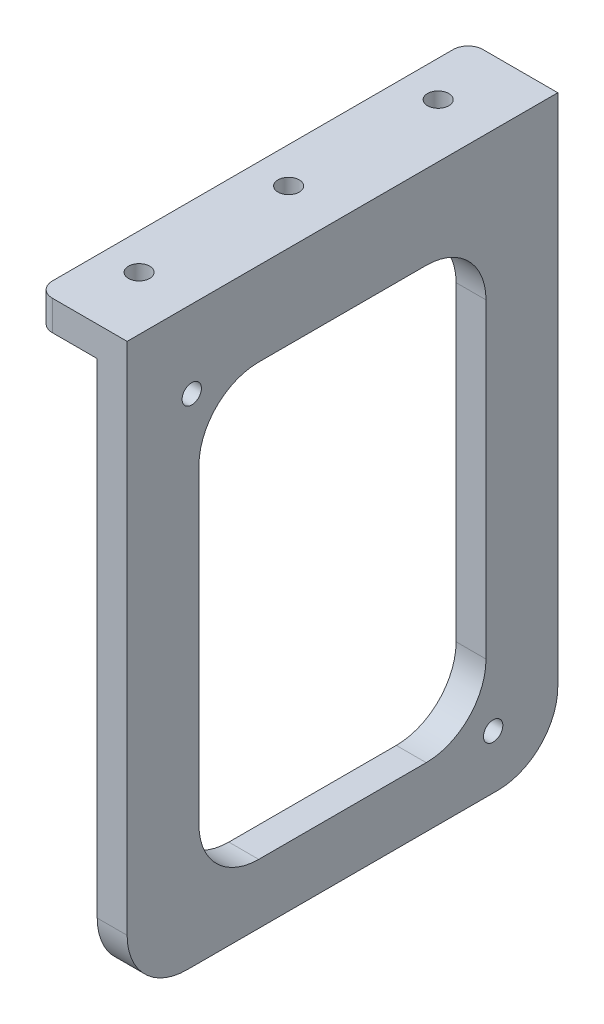
ISO-10303-21;
HEADER;
FILE_DESCRIPTION(('STEP AP214'),'2;1');
FILE_NAME('part.step','',(''),(''),'','','');
FILE_SCHEMA(('AUTOMOTIVE_DESIGN { 1 0 10303 214 1 1 1 1 }'));
ENDSEC;
DATA;
#1=APPLICATION_CONTEXT('core data for automotive mechanical design processes');
#2=APPLICATION_PROTOCOL_DEFINITION('international standard','automotive_design',2000,#1);
#3=PRODUCT_CONTEXT('',#1,'mechanical');
#4=PRODUCT('Part','Part','',(#3));
#5=PRODUCT_RELATED_PRODUCT_CATEGORY('part','',(#4));
#6=PRODUCT_DEFINITION_FORMATION('','',#4);
#7=PRODUCT_DEFINITION_CONTEXT('part definition',#1,'design');
#8=PRODUCT_DEFINITION('design','',#6,#7);
#9=PRODUCT_DEFINITION_SHAPE('','',#8);
#10=(LENGTH_UNIT() NAMED_UNIT(*) SI_UNIT(.MILLI.,.METRE.));
#11=(NAMED_UNIT(*) PLANE_ANGLE_UNIT() SI_UNIT($,.RADIAN.));
#12=(NAMED_UNIT(*) SI_UNIT($,.STERADIAN.) SOLID_ANGLE_UNIT());
#13=UNCERTAINTY_MEASURE_WITH_UNIT(LENGTH_MEASURE(1.E-05),#10,'distance_accuracy_value','');
#14=(GEOMETRIC_REPRESENTATION_CONTEXT(3) GLOBAL_UNCERTAINTY_ASSIGNED_CONTEXT((#13)) GLOBAL_UNIT_ASSIGNED_CONTEXT((#10,
#11,#12)) REPRESENTATION_CONTEXT('',''));
#15=CARTESIAN_POINT('',(0.,0.,0.));
#16=DIRECTION('',(0.,0.,1.));
#17=DIRECTION('',(1.,0.,0.));
#18=AXIS2_PLACEMENT_3D('',#15,#16,#17);
#19=CARTESIAN_POINT('',(6.35,27.305,-22.86));
#20=DIRECTION('',(1.,0.,0.));
#21=DIRECTION('',(0.,0.,-1.));
#22=AXIS2_PLACEMENT_3D('',#19,#20,#21);
#23=PLANE('',#22);
#24=CARTESIAN_POINT('',(6.35,22.23,16.));
#25=DIRECTION('',(-1.,0.,0.));
#26=DIRECTION('',(0.,0.,1.));
#27=AXIS2_PLACEMENT_3D('',#24,#25,#26);
#28=CIRCLE('',#27,1.025);
#29=CARTESIAN_POINT('',(6.35,22.23,17.025));
#30=VERTEX_POINT('',#29);
#31=EDGE_CURVE('E278',#30,#30,#28,.T.);
#32=ORIENTED_EDGE('',*,*,#31,.F.);
#33=EDGE_LOOP('',(#32));
#34=FACE_BOUND('',#33,.T.);
#35=DIRECTION('',(0.,-1.,0.));
#36=VECTOR('',#35,1.);
#37=CARTESIAN_POINT('',(6.35,-30.48,-22.86));
#38=LINE('',#37,#36);
#39=CARTESIAN_POINT('',(6.35,27.305,-22.86));
#40=VERTEX_POINT('',#39);
#41=CARTESIAN_POINT('',(6.35,-24.13,-22.86));
#42=VERTEX_POINT('',#41);
#43=EDGE_CURVE('E299',#40,#42,#38,.T.);
#44=ORIENTED_EDGE('',*,*,#43,.T.);
#45=CARTESIAN_POINT('',(6.35,-24.13,-16.51));
#46=DIRECTION('',(1.,0.,0.));
#47=DIRECTION('',(0.,0.,-1.));
#48=AXIS2_PLACEMENT_3D('',#45,#46,#47);
#49=CIRCLE('',#48,6.35);
#50=CARTESIAN_POINT('',(6.35,-30.48,-16.51));
#51=VERTEX_POINT('',#50);
#52=EDGE_CURVE('E225',#42,#51,#49,.F.);
#53=ORIENTED_EDGE('',*,*,#52,.T.);
#54=DIRECTION('',(0.,0.,1.));
#55=VECTOR('',#54,1.);
#56=CARTESIAN_POINT('',(6.35,-30.48,-22.86));
#57=LINE('',#56,#55);
#58=CARTESIAN_POINT('',(6.35,-30.48,16.51));
#59=VERTEX_POINT('',#58);
#60=EDGE_CURVE('E174',#51,#59,#57,.T.);
#61=ORIENTED_EDGE('',*,*,#60,.T.);
#62=CARTESIAN_POINT('',(6.35,-24.13,16.51));
#63=DIRECTION('',(1.,0.,0.));
#64=DIRECTION('',(0.,0.,-1.));
#65=AXIS2_PLACEMENT_3D('',#62,#63,#64);
#66=CIRCLE('',#65,6.35);
#67=CARTESIAN_POINT('',(6.35,-24.13,22.86));
#68=VERTEX_POINT('',#67);
#69=EDGE_CURVE('E170',#59,#68,#66,.F.);
#70=ORIENTED_EDGE('',*,*,#69,.T.);
#71=DIRECTION('',(0.,1.,0.));
#72=VECTOR('',#71,1.);
#73=CARTESIAN_POINT('',(6.35,-30.48,22.86));
#74=LINE('',#73,#72);
#75=CARTESIAN_POINT('',(6.35,27.305,22.86));
#76=VERTEX_POINT('',#75);
#77=EDGE_CURVE('E163',#68,#76,#74,.T.);
#78=ORIENTED_EDGE('',*,*,#77,.T.);
#79=DIRECTION('',(0.,0.,-1.));
#80=VECTOR('',#79,1.);
#81=CARTESIAN_POINT('',(6.35,27.305,-22.86));
#82=LINE('',#81,#80);
#83=EDGE_CURVE('E167',#76,#40,#82,.T.);
#84=ORIENTED_EDGE('',*,*,#83,.T.);
#85=EDGE_LOOP('',(#44,#53,#61,#70,#78,#84));
#86=FACE_BOUND('',#85,.T.);
#87=DIRECTION('',(0.,-1.,0.));
#88=VECTOR('',#87,1.);
#89=CARTESIAN_POINT('',(6.35,27.305,15.24));
#90=LINE('',#89,#88);
#91=CARTESIAN_POINT('',(6.35,15.24,15.24));
#92=VERTEX_POINT('',#91);
#93=CARTESIAN_POINT('',(6.35,-17.78,15.24));
#94=VERTEX_POINT('',#93);
#95=EDGE_CURVE('E212',#92,#94,#90,.T.);
#96=ORIENTED_EDGE('',*,*,#95,.T.);
#97=CARTESIAN_POINT('',(6.35,-17.78,8.89));
#98=DIRECTION('',(1.,0.,0.));
#99=DIRECTION('',(0.,0.,-1.));
#100=AXIS2_PLACEMENT_3D('',#97,#98,#99);
#101=CIRCLE('',#100,6.35);
#102=CARTESIAN_POINT('',(6.35,-24.13,8.89));
#103=VERTEX_POINT('',#102);
#104=EDGE_CURVE('E264',#94,#103,#101,.T.);
#105=ORIENTED_EDGE('',*,*,#104,.T.);
#106=DIRECTION('',(0.,0.,-1.));
#107=VECTOR('',#106,1.);
#108=CARTESIAN_POINT('',(6.35,-24.13,-22.86));
#109=LINE('',#108,#107);
#110=CARTESIAN_POINT('',(6.35,-24.13,-8.89));
#111=VERTEX_POINT('',#110);
#112=EDGE_CURVE('E215',#103,#111,#109,.T.);
#113=ORIENTED_EDGE('',*,*,#112,.T.);
#114=CARTESIAN_POINT('',(6.35,-17.78,-8.89));
#115=DIRECTION('',(1.,0.,0.));
#116=DIRECTION('',(0.,0.,-1.));
#117=AXIS2_PLACEMENT_3D('',#114,#115,#116);
#118=CIRCLE('',#117,6.35);
#119=CARTESIAN_POINT('',(6.35,-17.78,-15.24));
#120=VERTEX_POINT('',#119);
#121=EDGE_CURVE('E260',#111,#120,#118,.T.);
#122=ORIENTED_EDGE('',*,*,#121,.T.);
#123=DIRECTION('',(0.,1.,0.));
#124=VECTOR('',#123,1.);
#125=CARTESIAN_POINT('',(6.35,27.305,-15.24));
#126=LINE('',#125,#124);
#127=CARTESIAN_POINT('',(6.35,15.24,-15.24));
#128=VERTEX_POINT('',#127);
#129=EDGE_CURVE('E218',#120,#128,#126,.T.);
#130=ORIENTED_EDGE('',*,*,#129,.T.);
#131=CARTESIAN_POINT('',(6.35,15.24,-8.89));
#132=DIRECTION('',(1.,0.,0.));
#133=DIRECTION('',(0.,0.,-1.));
#134=AXIS2_PLACEMENT_3D('',#131,#132,#133);
#135=CIRCLE('',#134,6.35);
#136=CARTESIAN_POINT('',(6.35,21.59,-8.89));
#137=VERTEX_POINT('',#136);
#138=EDGE_CURVE('E268',#128,#137,#135,.T.);
#139=ORIENTED_EDGE('',*,*,#138,.T.);
#140=DIRECTION('',(0.,0.,1.));
#141=VECTOR('',#140,1.);
#142=CARTESIAN_POINT('',(6.35,21.59,-22.86));
#143=LINE('',#142,#141);
#144=CARTESIAN_POINT('',(6.35,21.59,8.89));
#145=VERTEX_POINT('',#144);
#146=EDGE_CURVE('E209',#137,#145,#143,.T.);
#147=ORIENTED_EDGE('',*,*,#146,.T.);
#148=CARTESIAN_POINT('',(6.35,15.24,8.89));
#149=DIRECTION('',(1.,0.,0.));
#150=DIRECTION('',(0.,0.,-1.));
#151=AXIS2_PLACEMENT_3D('',#148,#149,#150);
#152=CIRCLE('',#151,6.35);
#153=EDGE_CURVE('E272',#145,#92,#152,.T.);
#154=ORIENTED_EDGE('',*,*,#153,.T.);
#155=EDGE_LOOP('',(#96,#105,#113,#122,#130,#139,#147,#154));
#156=FACE_BOUND('',#155,.T.);
#157=CARTESIAN_POINT('',(6.35,-24.77,-16.));
#158=DIRECTION('',(-1.,0.,0.));
#159=DIRECTION('',(0.,0.,1.));
#160=AXIS2_PLACEMENT_3D('',#157,#158,#159);
#161=CIRCLE('',#160,1.025);
#162=CARTESIAN_POINT('',(6.35,-24.77,-14.975));
#163=VERTEX_POINT('',#162);
#164=EDGE_CURVE('E277',#163,#163,#161,.T.);
#165=ORIENTED_EDGE('',*,*,#164,.F.);
#166=EDGE_LOOP('',(#165));
#167=FACE_BOUND('',#166,.T.);
#168=ADVANCED_FACE('F36',(#34,#86,#156,#167),#23,.F.);
#169=CARTESIAN_POINT('',(9.525,-30.48,-22.86));
#170=DIRECTION('',(0.,0.,1.));
#171=DIRECTION('',(1.,0.,0.));
#172=AXIS2_PLACEMENT_3D('',#169,#170,#171);
#173=PLANE('',#172);
#174=DIRECTION('',(-1.,0.,0.));
#175=VECTOR('',#174,1.);
#176=CARTESIAN_POINT('',(6.35,27.305,-22.86));
#177=LINE('',#176,#175);
#178=CARTESIAN_POINT('',(1.5875,27.305,-22.86));
#179=VERTEX_POINT('',#178);
#180=EDGE_CURVE('E181',#40,#179,#177,.T.);
#181=ORIENTED_EDGE('',*,*,#180,.T.);
#182=DIRECTION('',(0.,1.,0.));
#183=VECTOR('',#182,1.);
#184=CARTESIAN_POINT('',(1.5875,30.48,-22.86));
#185=LINE('',#184,#183);
#186=CARTESIAN_POINT('',(1.5875,30.48,-22.86));
#187=VERTEX_POINT('',#186);
#188=EDGE_CURVE('E11',#179,#187,#185,.T.);
#189=ORIENTED_EDGE('',*,*,#188,.T.);
#190=DIRECTION('',(-1.,0.,0.));
#191=VECTOR('',#190,1.);
#192=CARTESIAN_POINT('',(9.525,30.48,-22.86));
#193=LINE('',#192,#191);
#194=CARTESIAN_POINT('',(9.525,30.48,-22.86));
#195=VERTEX_POINT('',#194);
#196=EDGE_CURVE('E206',#195,#187,#193,.T.);
#197=ORIENTED_EDGE('',*,*,#196,.F.);
#198=DIRECTION('',(0.,1.,0.));
#199=VECTOR('',#198,1.);
#200=CARTESIAN_POINT('',(9.525,-30.48,-22.86));
#201=LINE('',#200,#199);
#202=CARTESIAN_POINT('',(9.525,-24.13,-22.86));
#203=VERTEX_POINT('',#202);
#204=EDGE_CURVE('E193',#203,#195,#201,.T.);
#205=ORIENTED_EDGE('',*,*,#204,.F.);
#206=DIRECTION('',(-1.,0.,0.));
#207=VECTOR('',#206,1.);
#208=CARTESIAN_POINT('',(9.525,-24.13,-22.86));
#209=LINE('',#208,#207);
#210=EDGE_CURVE('E221',#203,#42,#209,.T.);
#211=ORIENTED_EDGE('',*,*,#210,.T.);
#212=ORIENTED_EDGE('',*,*,#43,.F.);
#213=EDGE_LOOP('',(#181,#189,#197,#205,#211,#212));
#214=FACE_BOUND('',#213,.T.);
#215=ADVANCED_FACE('F345',(#214),#173,.F.);
#216=CARTESIAN_POINT('',(9.525,30.48,22.86));
#217=DIRECTION('',(0.,-1.,0.));
#218=DIRECTION('',(0.,0.,-1.));
#219=AXIS2_PLACEMENT_3D('',#216,#217,#218);
#220=PLANE('',#219);
#221=CARTESIAN_POINT('',(3.81,30.48,-15.875));
#222=DIRECTION('',(0.,1.,0.));
#223=DIRECTION('',(0.,0.,1.));
#224=AXIS2_PLACEMENT_3D('',#221,#222,#223);
#225=CIRCLE('',#224,1.13029999999999);
#226=CARTESIAN_POINT('',(3.81,30.48,-14.7447));
#227=VERTEX_POINT('',#226);
#228=EDGE_CURVE('E337',#227,#227,#225,.T.);
#229=ORIENTED_EDGE('',*,*,#228,.F.);
#230=EDGE_LOOP('',(#229));
#231=FACE_BOUND('',#230,.T.);
#232=CARTESIAN_POINT('',(3.81,30.48,15.875));
#233=DIRECTION('',(0.,1.,0.));
#234=DIRECTION('',(0.,0.,1.));
#235=AXIS2_PLACEMENT_3D('',#232,#233,#234);
#236=CIRCLE('',#235,1.13029999999999);
#237=CARTESIAN_POINT('',(3.81,30.48,17.0053));
#238=VERTEX_POINT('',#237);
#239=EDGE_CURVE('E331',#238,#238,#236,.T.);
#240=ORIENTED_EDGE('',*,*,#239,.F.);
#241=EDGE_LOOP('',(#240));
#242=FACE_BOUND('',#241,.T.);
#243=CARTESIAN_POINT('',(3.81,30.48,0.));
#244=DIRECTION('',(0.,1.,0.));
#245=DIRECTION('',(0.,0.,1.));
#246=AXIS2_PLACEMENT_3D('',#243,#244,#245);
#247=CIRCLE('',#246,1.13029999999999);
#248=CARTESIAN_POINT('',(3.81,30.48,1.13029999999999));
#249=VERTEX_POINT('',#248);
#250=EDGE_CURVE('E325',#249,#249,#247,.T.);
#251=ORIENTED_EDGE('',*,*,#250,.F.);
#252=EDGE_LOOP('',(#251));
#253=FACE_BOUND('',#252,.T.);
#254=DIRECTION('',(0.,0.,1.));
#255=VECTOR('',#254,1.);
#256=CARTESIAN_POINT('',(0.,30.48,22.86));
#257=LINE('',#256,#255);
#258=CARTESIAN_POINT('',(0.,30.48,-21.2725));
#259=VERTEX_POINT('',#258);
#260=CARTESIAN_POINT('',(0.,30.48,21.2725));
#261=VERTEX_POINT('',#260);
#262=EDGE_CURVE('E189',#259,#261,#257,.T.);
#263=ORIENTED_EDGE('',*,*,#262,.T.);
#264=CARTESIAN_POINT('',(1.5875,30.48,21.2725));
#265=DIRECTION('',(0.,-1.,0.));
#266=DIRECTION('',(0.,0.,-1.));
#267=AXIS2_PLACEMENT_3D('',#264,#265,#266);
#268=CIRCLE('',#267,1.5875);
#269=CARTESIAN_POINT('',(1.5875,30.48,22.86));
#270=VERTEX_POINT('',#269);
#271=EDGE_CURVE('E44',#261,#270,#268,.F.);
#272=ORIENTED_EDGE('',*,*,#271,.T.);
#273=DIRECTION('',(-1.,0.,0.));
#274=VECTOR('',#273,1.);
#275=CARTESIAN_POINT('',(9.525,30.48,22.86));
#276=LINE('',#275,#274);
#277=CARTESIAN_POINT('',(9.525,30.48,22.86));
#278=VERTEX_POINT('',#277);
#279=EDGE_CURVE('E203',#278,#270,#276,.T.);
#280=ORIENTED_EDGE('',*,*,#279,.F.);
#281=DIRECTION('',(0.,0.,1.));
#282=VECTOR('',#281,1.);
#283=CARTESIAN_POINT('',(9.525,30.48,22.86));
#284=LINE('',#283,#282);
#285=EDGE_CURVE('E195',#195,#278,#284,.T.);
#286=ORIENTED_EDGE('',*,*,#285,.F.);
#287=ORIENTED_EDGE('',*,*,#196,.T.);
#288=CARTESIAN_POINT('',(1.5875,30.48,-21.2725));
#289=DIRECTION('',(0.,-1.,0.));
#290=DIRECTION('',(0.,0.,-1.));
#291=AXIS2_PLACEMENT_3D('',#288,#289,#290);
#292=CIRCLE('',#291,1.5875);
#293=EDGE_CURVE('E51',#187,#259,#292,.F.);
#294=ORIENTED_EDGE('',*,*,#293,.T.);
#295=EDGE_LOOP('',(#263,#272,#280,#286,#287,#294));
#296=FACE_BOUND('',#295,.T.);
#297=ADVANCED_FACE('F290',(#231,#242,#253,#296),#220,.F.);
#298=CARTESIAN_POINT('',(9.525,-30.48,22.86));
#299=DIRECTION('',(0.,0.,-1.));
#300=DIRECTION('',(-1.,0.,0.));
#301=AXIS2_PLACEMENT_3D('',#298,#299,#300);
#302=PLANE('',#301);
#303=ORIENTED_EDGE('',*,*,#279,.T.);
#304=DIRECTION('',(0.,-1.,0.));
#305=VECTOR('',#304,1.);
#306=CARTESIAN_POINT('',(1.5875,27.305,22.86));
#307=LINE('',#306,#305);
#308=CARTESIAN_POINT('',(1.5875,27.305,22.86));
#309=VERTEX_POINT('',#308);
#310=EDGE_CURVE('E187',#270,#309,#307,.T.);
#311=ORIENTED_EDGE('',*,*,#310,.T.);
#312=DIRECTION('',(-1.,0.,0.));
#313=VECTOR('',#312,1.);
#314=CARTESIAN_POINT('',(6.35,27.305,22.86));
#315=LINE('',#314,#313);
#316=EDGE_CURVE('E179',#76,#309,#315,.T.);
#317=ORIENTED_EDGE('',*,*,#316,.F.);
#318=ORIENTED_EDGE('',*,*,#77,.F.);
#319=DIRECTION('',(-1.,0.,0.));
#320=VECTOR('',#319,1.);
#321=CARTESIAN_POINT('',(9.525,-24.13,22.86));
#322=LINE('',#321,#320);
#323=CARTESIAN_POINT('',(9.525,-24.13,22.86));
#324=VERTEX_POINT('',#323);
#325=EDGE_CURVE('E236',#68,#324,#322,.F.);
#326=ORIENTED_EDGE('',*,*,#325,.T.);
#327=DIRECTION('',(0.,-1.,0.));
#328=VECTOR('',#327,1.);
#329=CARTESIAN_POINT('',(9.525,-30.48,22.86));
#330=LINE('',#329,#328);
#331=EDGE_CURVE('E197',#278,#324,#330,.T.);
#332=ORIENTED_EDGE('',*,*,#331,.F.);
#333=EDGE_LOOP('',(#303,#311,#317,#318,#326,#332));
#334=FACE_BOUND('',#333,.T.);
#335=ADVANCED_FACE('F185',(#334),#302,.F.);
#336=CARTESIAN_POINT('',(9.525,-30.48,22.86));
#337=DIRECTION('',(0.,1.,0.));
#338=DIRECTION('',(0.,0.,1.));
#339=AXIS2_PLACEMENT_3D('',#336,#337,#338);
#340=PLANE('',#339);
#341=ORIENTED_EDGE('',*,*,#60,.F.);
#342=DIRECTION('',(-1.,0.,0.));
#343=VECTOR('',#342,1.);
#344=CARTESIAN_POINT('',(9.525,-30.48,-16.51));
#345=LINE('',#344,#343);
#346=CARTESIAN_POINT('',(9.525,-30.48,-16.51));
#347=VERTEX_POINT('',#346);
#348=EDGE_CURVE('E230',#51,#347,#345,.F.);
#349=ORIENTED_EDGE('',*,*,#348,.T.);
#350=DIRECTION('',(0.,0.,-1.));
#351=VECTOR('',#350,1.);
#352=CARTESIAN_POINT('',(9.525,-30.48,22.86));
#353=LINE('',#352,#351);
#354=CARTESIAN_POINT('',(9.525,-30.48,16.51));
#355=VERTEX_POINT('',#354);
#356=EDGE_CURVE('E200',#355,#347,#353,.T.);
#357=ORIENTED_EDGE('',*,*,#356,.F.);
#358=DIRECTION('',(-1.,0.,0.));
#359=VECTOR('',#358,1.);
#360=CARTESIAN_POINT('',(9.525,-30.48,16.51));
#361=LINE('',#360,#359);
#362=EDGE_CURVE('E227',#355,#59,#361,.T.);
#363=ORIENTED_EDGE('',*,*,#362,.T.);
#364=EDGE_LOOP('',(#341,#349,#357,#363));
#365=FACE_BOUND('',#364,.T.);
#366=ADVANCED_FACE('F386',(#365),#340,.F.);
#367=CARTESIAN_POINT('',(9.525,30.48,-22.86));
#368=DIRECTION('',(-1.,0.,0.));
#369=DIRECTION('',(0.,0.,1.));
#370=AXIS2_PLACEMENT_3D('',#367,#368,#369);
#371=PLANE('',#370);
#372=CARTESIAN_POINT('',(9.525,22.23,16.));
#373=DIRECTION('',(-1.,0.,0.));
#374=DIRECTION('',(0.,0.,1.));
#375=AXIS2_PLACEMENT_3D('',#372,#373,#374);
#376=CIRCLE('',#375,1.025);
#377=CARTESIAN_POINT('',(9.525,22.23,17.025));
#378=VERTEX_POINT('',#377);
#379=EDGE_CURVE('E274',#378,#378,#376,.T.);
#380=ORIENTED_EDGE('',*,*,#379,.T.);
#381=EDGE_LOOP('',(#380));
#382=FACE_BOUND('',#381,.T.);
#383=CARTESIAN_POINT('',(9.525,-24.77,-16.));
#384=DIRECTION('',(-1.,0.,0.));
#385=DIRECTION('',(0.,0.,1.));
#386=AXIS2_PLACEMENT_3D('',#383,#384,#385);
#387=CIRCLE('',#386,1.025);
#388=CARTESIAN_POINT('',(9.525,-24.77,-14.975));
#389=VERTEX_POINT('',#388);
#390=EDGE_CURVE('E315',#389,#389,#387,.T.);
#391=ORIENTED_EDGE('',*,*,#390,.T.);
#392=EDGE_LOOP('',(#391));
#393=FACE_BOUND('',#392,.T.);
#394=DIRECTION('',(0.,0.,1.));
#395=VECTOR('',#394,1.);
#396=CARTESIAN_POINT('',(9.525,21.59,15.24));
#397=LINE('',#396,#395);
#398=CARTESIAN_POINT('',(9.525,21.59,-8.88999999999999));
#399=VERTEX_POINT('',#398);
#400=CARTESIAN_POINT('',(9.525,21.59,8.89));
#401=VERTEX_POINT('',#400);
#402=EDGE_CURVE('E309',#399,#401,#397,.T.);
#403=ORIENTED_EDGE('',*,*,#402,.F.);
#404=CARTESIAN_POINT('',(9.525,15.24,-8.89));
#405=DIRECTION('',(-1.,0.,0.));
#406=DIRECTION('',(0.,0.,1.));
#407=AXIS2_PLACEMENT_3D('',#404,#405,#406);
#408=CIRCLE('',#407,6.35);
#409=CARTESIAN_POINT('',(9.525,15.24,-15.24));
#410=VERTEX_POINT('',#409);
#411=EDGE_CURVE('E266',#399,#410,#408,.T.);
#412=ORIENTED_EDGE('',*,*,#411,.T.);
#413=DIRECTION('',(0.,1.,0.));
#414=VECTOR('',#413,1.);
#415=CARTESIAN_POINT('',(9.525,-24.13,-15.24));
#416=LINE('',#415,#414);
#417=CARTESIAN_POINT('',(9.525,-17.78,-15.24));
#418=VERTEX_POINT('',#417);
#419=EDGE_CURVE('E312',#418,#410,#416,.T.);
#420=ORIENTED_EDGE('',*,*,#419,.F.);
#421=CARTESIAN_POINT('',(9.525,-17.78,-8.89));
#422=DIRECTION('',(-1.,0.,0.));
#423=DIRECTION('',(0.,0.,1.));
#424=AXIS2_PLACEMENT_3D('',#421,#422,#423);
#425=CIRCLE('',#424,6.35);
#426=CARTESIAN_POINT('',(9.525,-24.13,-8.88999999999999));
#427=VERTEX_POINT('',#426);
#428=EDGE_CURVE('E258',#418,#427,#425,.T.);
#429=ORIENTED_EDGE('',*,*,#428,.T.);
#430=DIRECTION('',(0.,0.,-1.));
#431=VECTOR('',#430,1.);
#432=CARTESIAN_POINT('',(9.525,-24.13,15.24));
#433=LINE('',#432,#431);
#434=CARTESIAN_POINT('',(9.525,-24.13,8.89));
#435=VERTEX_POINT('',#434);
#436=EDGE_CURVE('E300',#435,#427,#433,.T.);
#437=ORIENTED_EDGE('',*,*,#436,.F.);
#438=CARTESIAN_POINT('',(9.525,-17.78,8.89));
#439=DIRECTION('',(-1.,0.,0.));
#440=DIRECTION('',(0.,0.,1.));
#441=AXIS2_PLACEMENT_3D('',#438,#439,#440);
#442=CIRCLE('',#441,6.35);
#443=CARTESIAN_POINT('',(9.525,-17.78,15.24));
#444=VERTEX_POINT('',#443);
#445=EDGE_CURVE('E262',#435,#444,#442,.T.);
#446=ORIENTED_EDGE('',*,*,#445,.T.);
#447=DIRECTION('',(0.,-1.,0.));
#448=VECTOR('',#447,1.);
#449=CARTESIAN_POINT('',(9.525,-24.13,15.24));
#450=LINE('',#449,#448);
#451=CARTESIAN_POINT('',(9.525,15.24,15.24));
#452=VERTEX_POINT('',#451);
#453=EDGE_CURVE('E303',#452,#444,#450,.T.);
#454=ORIENTED_EDGE('',*,*,#453,.F.);
#455=CARTESIAN_POINT('',(9.525,15.24,8.89));
#456=DIRECTION('',(-1.,0.,0.));
#457=DIRECTION('',(0.,0.,1.));
#458=AXIS2_PLACEMENT_3D('',#455,#456,#457);
#459=CIRCLE('',#458,6.35);
#460=EDGE_CURVE('E270',#452,#401,#459,.T.);
#461=ORIENTED_EDGE('',*,*,#460,.T.);
#462=EDGE_LOOP('',(#403,#412,#420,#429,#437,#446,#454,#461));
#463=FACE_BOUND('',#462,.T.);
#464=ORIENTED_EDGE('',*,*,#356,.T.);
#465=CARTESIAN_POINT('',(9.525,-24.13,-16.51));
#466=DIRECTION('',(-1.,0.,0.));
#467=DIRECTION('',(0.,0.,1.));
#468=AXIS2_PLACEMENT_3D('',#465,#466,#467);
#469=CIRCLE('',#468,6.35);
#470=EDGE_CURVE('E234',#347,#203,#469,.F.);
#471=ORIENTED_EDGE('',*,*,#470,.T.);
#472=ORIENTED_EDGE('',*,*,#204,.T.);
#473=ORIENTED_EDGE('',*,*,#285,.T.);
#474=ORIENTED_EDGE('',*,*,#331,.T.);
#475=CARTESIAN_POINT('',(9.525,-24.13,16.51));
#476=DIRECTION('',(-1.,0.,0.));
#477=DIRECTION('',(0.,0.,1.));
#478=AXIS2_PLACEMENT_3D('',#475,#476,#477);
#479=CIRCLE('',#478,6.35);
#480=EDGE_CURVE('E232',#324,#355,#479,.F.);
#481=ORIENTED_EDGE('',*,*,#480,.T.);
#482=EDGE_LOOP('',(#464,#471,#472,#473,#474,#481));
#483=FACE_BOUND('',#482,.T.);
#484=ADVANCED_FACE('F383',(#382,#393,#463,#483),#371,.F.);
#485=CARTESIAN_POINT('',(0.,30.48,-22.86));
#486=DIRECTION('',(-1.,0.,0.));
#487=DIRECTION('',(0.,0.,1.));
#488=AXIS2_PLACEMENT_3D('',#485,#486,#487);
#489=PLANE('',#488);
#490=DIRECTION('',(0.,0.,-1.));
#491=VECTOR('',#490,1.);
#492=CARTESIAN_POINT('',(0.,27.305,-22.86));
#493=LINE('',#492,#491);
#494=CARTESIAN_POINT('',(0.,27.305,21.2725));
#495=VERTEX_POINT('',#494);
#496=CARTESIAN_POINT('',(0.,27.305,-21.2725));
#497=VERTEX_POINT('',#496);
#498=EDGE_CURVE('E296',#495,#497,#493,.T.);
#499=ORIENTED_EDGE('',*,*,#498,.F.);
#500=DIRECTION('',(0.,-1.,0.));
#501=VECTOR('',#500,1.);
#502=CARTESIAN_POINT('',(0.,30.48,21.2725));
#503=LINE('',#502,#501);
#504=EDGE_CURVE('E58',#495,#261,#503,.F.);
#505=ORIENTED_EDGE('',*,*,#504,.T.);
#506=ORIENTED_EDGE('',*,*,#262,.F.);
#507=DIRECTION('',(0.,1.,0.));
#508=VECTOR('',#507,1.);
#509=CARTESIAN_POINT('',(0.,27.305,-21.2725));
#510=LINE('',#509,#508);
#511=EDGE_CURVE('E284',#259,#497,#510,.F.);
#512=ORIENTED_EDGE('',*,*,#511,.T.);
#513=EDGE_LOOP('',(#499,#505,#506,#512));
#514=FACE_BOUND('',#513,.T.);
#515=ADVANCED_FACE('F298',(#514),#489,.T.);
#516=CARTESIAN_POINT('',(6.35,27.305,-22.86));
#517=DIRECTION('',(0.,1.,0.));
#518=DIRECTION('',(0.,0.,1.));
#519=AXIS2_PLACEMENT_3D('',#516,#517,#518);
#520=PLANE('',#519);
#521=CARTESIAN_POINT('',(3.81,27.305,-15.875));
#522=DIRECTION('',(0.,1.,0.));
#523=DIRECTION('',(0.,0.,1.));
#524=AXIS2_PLACEMENT_3D('',#521,#522,#523);
#525=CIRCLE('',#524,1.13029999999999);
#526=CARTESIAN_POINT('',(3.81,27.305,-14.7447));
#527=VERTEX_POINT('',#526);
#528=EDGE_CURVE('E334',#527,#527,#525,.T.);
#529=ORIENTED_EDGE('',*,*,#528,.T.);
#530=EDGE_LOOP('',(#529));
#531=FACE_BOUND('',#530,.T.);
#532=CARTESIAN_POINT('',(3.81,27.305,15.875));
#533=DIRECTION('',(0.,1.,0.));
#534=DIRECTION('',(0.,0.,1.));
#535=AXIS2_PLACEMENT_3D('',#532,#533,#534);
#536=CIRCLE('',#535,1.13029999999999);
#537=CARTESIAN_POINT('',(3.81,27.305,17.0053));
#538=VERTEX_POINT('',#537);
#539=EDGE_CURVE('E328',#538,#538,#536,.T.);
#540=ORIENTED_EDGE('',*,*,#539,.T.);
#541=EDGE_LOOP('',(#540));
#542=FACE_BOUND('',#541,.T.);
#543=CARTESIAN_POINT('',(3.81,27.305,0.));
#544=DIRECTION('',(0.,1.,0.));
#545=DIRECTION('',(0.,0.,1.));
#546=AXIS2_PLACEMENT_3D('',#543,#544,#545);
#547=CIRCLE('',#546,1.13029999999999);
#548=CARTESIAN_POINT('',(3.81,27.305,1.13029999999999));
#549=VERTEX_POINT('',#548);
#550=EDGE_CURVE('E322',#549,#549,#547,.T.);
#551=ORIENTED_EDGE('',*,*,#550,.T.);
#552=EDGE_LOOP('',(#551));
#553=FACE_BOUND('',#552,.T.);
#554=ORIENTED_EDGE('',*,*,#316,.T.);
#555=CARTESIAN_POINT('',(1.5875,27.305,21.2725));
#556=DIRECTION('',(0.,1.,0.));
#557=DIRECTION('',(0.,0.,1.));
#558=AXIS2_PLACEMENT_3D('',#555,#556,#557);
#559=CIRCLE('',#558,1.5875);
#560=EDGE_CURVE('E282',#309,#495,#559,.F.);
#561=ORIENTED_EDGE('',*,*,#560,.T.);
#562=ORIENTED_EDGE('',*,*,#498,.T.);
#563=CARTESIAN_POINT('',(1.5875,27.305,-21.2725));
#564=DIRECTION('',(0.,1.,0.));
#565=DIRECTION('',(0.,0.,1.));
#566=AXIS2_PLACEMENT_3D('',#563,#564,#565);
#567=CIRCLE('',#566,1.5875);
#568=EDGE_CURVE('E280',#497,#179,#567,.F.);
#569=ORIENTED_EDGE('',*,*,#568,.T.);
#570=ORIENTED_EDGE('',*,*,#180,.F.);
#571=ORIENTED_EDGE('',*,*,#83,.F.);
#572=EDGE_LOOP('',(#554,#561,#562,#569,#570,#571));
#573=FACE_BOUND('',#572,.T.);
#574=ADVANCED_FACE('F178',(#531,#542,#553,#573),#520,.F.);
#575=CARTESIAN_POINT('',(0.,-24.13,-15.24));
#576=DIRECTION('',(0.,0.,-1.));
#577=DIRECTION('',(-1.,0.,0.));
#578=AXIS2_PLACEMENT_3D('',#575,#576,#577);
#579=PLANE('',#578);
#580=ORIENTED_EDGE('',*,*,#129,.F.);
#581=DIRECTION('',(1.,0.,0.));
#582=VECTOR('',#581,1.);
#583=CARTESIAN_POINT('',(9.525,-17.78,-15.24));
#584=LINE('',#583,#582);
#585=EDGE_CURVE('E240',#120,#418,#584,.T.);
#586=ORIENTED_EDGE('',*,*,#585,.T.);
#587=ORIENTED_EDGE('',*,*,#419,.T.);
#588=DIRECTION('',(1.,0.,0.));
#589=VECTOR('',#588,1.);
#590=CARTESIAN_POINT('',(6.35,15.24,-15.24));
#591=LINE('',#590,#589);
#592=EDGE_CURVE('E238',#410,#128,#591,.F.);
#593=ORIENTED_EDGE('',*,*,#592,.T.);
#594=EDGE_LOOP('',(#580,#586,#587,#593));
#595=FACE_BOUND('',#594,.T.);
#596=ADVANCED_FACE('F378',(#595),#579,.F.);
#597=CARTESIAN_POINT('',(0.,-24.13,15.24));
#598=DIRECTION('',(0.,-1.,0.));
#599=DIRECTION('',(0.,0.,-1.));
#600=AXIS2_PLACEMENT_3D('',#597,#598,#599);
#601=PLANE('',#600);
#602=ORIENTED_EDGE('',*,*,#436,.T.);
#603=DIRECTION('',(1.,0.,0.));
#604=VECTOR('',#603,1.);
#605=CARTESIAN_POINT('',(6.35,-24.13,-8.89));
#606=LINE('',#605,#604);
#607=EDGE_CURVE('E246',#427,#111,#606,.F.);
#608=ORIENTED_EDGE('',*,*,#607,.T.);
#609=ORIENTED_EDGE('',*,*,#112,.F.);
#610=DIRECTION('',(1.,0.,0.));
#611=VECTOR('',#610,1.);
#612=CARTESIAN_POINT('',(9.525,-24.13,8.89));
#613=LINE('',#612,#611);
#614=EDGE_CURVE('E243',#103,#435,#613,.T.);
#615=ORIENTED_EDGE('',*,*,#614,.T.);
#616=EDGE_LOOP('',(#602,#608,#609,#615));
#617=FACE_BOUND('',#616,.T.);
#618=ADVANCED_FACE('F496',(#617),#601,.F.);
#619=CARTESIAN_POINT('',(0.,-24.13,15.24));
#620=DIRECTION('',(0.,0.,1.));
#621=DIRECTION('',(1.,0.,0.));
#622=AXIS2_PLACEMENT_3D('',#619,#620,#621);
#623=PLANE('',#622);
#624=ORIENTED_EDGE('',*,*,#453,.T.);
#625=DIRECTION('',(1.,0.,0.));
#626=VECTOR('',#625,1.);
#627=CARTESIAN_POINT('',(6.35,-17.78,15.24));
#628=LINE('',#627,#626);
#629=EDGE_CURVE('E251',#444,#94,#628,.F.);
#630=ORIENTED_EDGE('',*,*,#629,.T.);
#631=ORIENTED_EDGE('',*,*,#95,.F.);
#632=DIRECTION('',(1.,0.,0.));
#633=VECTOR('',#632,1.);
#634=CARTESIAN_POINT('',(9.525,15.24,15.24));
#635=LINE('',#634,#633);
#636=EDGE_CURVE('E248',#92,#452,#635,.T.);
#637=ORIENTED_EDGE('',*,*,#636,.T.);
#638=EDGE_LOOP('',(#624,#630,#631,#637));
#639=FACE_BOUND('',#638,.T.);
#640=ADVANCED_FACE('F489',(#639),#623,.F.);
#641=CARTESIAN_POINT('',(0.,21.59,15.24));
#642=DIRECTION('',(0.,1.,0.));
#643=DIRECTION('',(0.,0.,1.));
#644=AXIS2_PLACEMENT_3D('',#641,#642,#643);
#645=PLANE('',#644);
#646=ORIENTED_EDGE('',*,*,#146,.F.);
#647=DIRECTION('',(1.,0.,0.));
#648=VECTOR('',#647,1.);
#649=CARTESIAN_POINT('',(9.525,21.59,-8.89));
#650=LINE('',#649,#648);
#651=EDGE_CURVE('E255',#137,#399,#650,.T.);
#652=ORIENTED_EDGE('',*,*,#651,.T.);
#653=ORIENTED_EDGE('',*,*,#402,.T.);
#654=DIRECTION('',(1.,0.,0.));
#655=VECTOR('',#654,1.);
#656=CARTESIAN_POINT('',(6.35,21.59,8.89));
#657=LINE('',#656,#655);
#658=EDGE_CURVE('E253',#401,#145,#657,.F.);
#659=ORIENTED_EDGE('',*,*,#658,.T.);
#660=EDGE_LOOP('',(#646,#652,#653,#659));
#661=FACE_BOUND('',#660,.T.);
#662=ADVANCED_FACE('F399',(#661),#645,.F.);
#663=CARTESIAN_POINT('',(9.525,-24.13,-16.51));
#664=DIRECTION('',(-1.,0.,0.));
#665=DIRECTION('',(0.,0.,1.));
#666=AXIS2_PLACEMENT_3D('',#663,#664,#665);
#667=CYLINDRICAL_SURFACE('',#666,6.35);
#668=ORIENTED_EDGE('',*,*,#470,.F.);
#669=ORIENTED_EDGE('',*,*,#348,.F.);
#670=ORIENTED_EDGE('',*,*,#52,.F.);
#671=ORIENTED_EDGE('',*,*,#210,.F.);
#672=EDGE_LOOP('',(#668,#669,#670,#671));
#673=FACE_BOUND('',#672,.T.);
#674=ADVANCED_FACE('F395',(#673),#667,.T.);
#675=CARTESIAN_POINT('',(9.525,-24.13,16.51));
#676=DIRECTION('',(-1.,0.,0.));
#677=DIRECTION('',(0.,0.,1.));
#678=AXIS2_PLACEMENT_3D('',#675,#676,#677);
#679=CYLINDRICAL_SURFACE('',#678,6.35);
#680=ORIENTED_EDGE('',*,*,#480,.F.);
#681=ORIENTED_EDGE('',*,*,#325,.F.);
#682=ORIENTED_EDGE('',*,*,#69,.F.);
#683=ORIENTED_EDGE('',*,*,#362,.F.);
#684=EDGE_LOOP('',(#680,#681,#682,#683));
#685=FACE_BOUND('',#684,.T.);
#686=ADVANCED_FACE('F398',(#685),#679,.T.);
#687=CARTESIAN_POINT('',(0.,-17.78,-8.89));
#688=DIRECTION('',(-1.,0.,0.));
#689=DIRECTION('',(0.,0.,1.));
#690=AXIS2_PLACEMENT_3D('',#687,#688,#689);
#691=CYLINDRICAL_SURFACE('',#690,6.35);
#692=ORIENTED_EDGE('',*,*,#121,.F.);
#693=ORIENTED_EDGE('',*,*,#607,.F.);
#694=ORIENTED_EDGE('',*,*,#428,.F.);
#695=ORIENTED_EDGE('',*,*,#585,.F.);
#696=EDGE_LOOP('',(#692,#693,#694,#695));
#697=FACE_BOUND('',#696,.T.);
#698=ADVANCED_FACE('F403',(#697),#691,.F.);
#699=CARTESIAN_POINT('',(0.,-17.78,8.89));
#700=DIRECTION('',(-1.,0.,0.));
#701=DIRECTION('',(0.,0.,1.));
#702=AXIS2_PLACEMENT_3D('',#699,#700,#701);
#703=CYLINDRICAL_SURFACE('',#702,6.35);
#704=ORIENTED_EDGE('',*,*,#104,.F.);
#705=ORIENTED_EDGE('',*,*,#629,.F.);
#706=ORIENTED_EDGE('',*,*,#445,.F.);
#707=ORIENTED_EDGE('',*,*,#614,.F.);
#708=EDGE_LOOP('',(#704,#705,#706,#707));
#709=FACE_BOUND('',#708,.T.);
#710=ADVANCED_FACE('F407',(#709),#703,.F.);
#711=CARTESIAN_POINT('',(0.,15.24,-8.89));
#712=DIRECTION('',(-1.,0.,0.));
#713=DIRECTION('',(0.,0.,1.));
#714=AXIS2_PLACEMENT_3D('',#711,#712,#713);
#715=CYLINDRICAL_SURFACE('',#714,6.35);
#716=ORIENTED_EDGE('',*,*,#138,.F.);
#717=ORIENTED_EDGE('',*,*,#592,.F.);
#718=ORIENTED_EDGE('',*,*,#411,.F.);
#719=ORIENTED_EDGE('',*,*,#651,.F.);
#720=EDGE_LOOP('',(#716,#717,#718,#719));
#721=FACE_BOUND('',#720,.T.);
#722=ADVANCED_FACE('F411',(#721),#715,.F.);
#723=CARTESIAN_POINT('',(0.,15.24,8.89));
#724=DIRECTION('',(-1.,0.,0.));
#725=DIRECTION('',(0.,0.,1.));
#726=AXIS2_PLACEMENT_3D('',#723,#724,#725);
#727=CYLINDRICAL_SURFACE('',#726,6.35);
#728=ORIENTED_EDGE('',*,*,#153,.F.);
#729=ORIENTED_EDGE('',*,*,#658,.F.);
#730=ORIENTED_EDGE('',*,*,#460,.F.);
#731=ORIENTED_EDGE('',*,*,#636,.F.);
#732=EDGE_LOOP('',(#728,#729,#730,#731));
#733=FACE_BOUND('',#732,.T.);
#734=ADVANCED_FACE('F415',(#733),#727,.F.);
#735=CARTESIAN_POINT('',(6.35,-24.77,-16.));
#736=DIRECTION('',(-1.,0.,0.));
#737=DIRECTION('',(0.,0.,1.));
#738=AXIS2_PLACEMENT_3D('',#735,#736,#737);
#739=CYLINDRICAL_SURFACE('',#738,1.025);
#740=ORIENTED_EDGE('',*,*,#164,.T.);
#741=EDGE_LOOP('',(#740));
#742=FACE_BOUND('',#741,.T.);
#743=ORIENTED_EDGE('',*,*,#390,.F.);
#744=EDGE_LOOP('',(#743));
#745=FACE_BOUND('',#744,.T.);
#746=ADVANCED_FACE('F363',(#742,#745),#739,.F.);
#747=CARTESIAN_POINT('',(6.35,22.23,16.));
#748=DIRECTION('',(-1.,0.,0.));
#749=DIRECTION('',(0.,0.,1.));
#750=AXIS2_PLACEMENT_3D('',#747,#748,#749);
#751=CYLINDRICAL_SURFACE('',#750,1.025);
#752=ORIENTED_EDGE('',*,*,#31,.T.);
#753=EDGE_LOOP('',(#752));
#754=FACE_BOUND('',#753,.T.);
#755=ORIENTED_EDGE('',*,*,#379,.F.);
#756=EDGE_LOOP('',(#755));
#757=FACE_BOUND('',#756,.T.);
#758=ADVANCED_FACE('F354',(#754,#757),#751,.F.);
#759=CARTESIAN_POINT('',(3.81,30.48,0.));
#760=DIRECTION('',(0.,1.,0.));
#761=DIRECTION('',(0.,0.,1.));
#762=AXIS2_PLACEMENT_3D('',#759,#760,#761);
#763=CYLINDRICAL_SURFACE('',#762,1.13029999999999);
#764=ORIENTED_EDGE('',*,*,#550,.F.);
#765=EDGE_LOOP('',(#764));
#766=FACE_BOUND('',#765,.T.);
#767=ORIENTED_EDGE('',*,*,#250,.T.);
#768=EDGE_LOOP('',(#767));
#769=FACE_BOUND('',#768,.T.);
#770=ADVANCED_FACE('F351',(#766,#769),#763,.F.);
#771=CARTESIAN_POINT('',(3.81,30.48,15.875));
#772=DIRECTION('',(0.,1.,0.));
#773=DIRECTION('',(0.,0.,1.));
#774=AXIS2_PLACEMENT_3D('',#771,#772,#773);
#775=CYLINDRICAL_SURFACE('',#774,1.13029999999999);
#776=ORIENTED_EDGE('',*,*,#539,.F.);
#777=EDGE_LOOP('',(#776));
#778=FACE_BOUND('',#777,.T.);
#779=ORIENTED_EDGE('',*,*,#239,.T.);
#780=EDGE_LOOP('',(#779));
#781=FACE_BOUND('',#780,.T.);
#782=ADVANCED_FACE('F353',(#778,#781),#775,.F.);
#783=CARTESIAN_POINT('',(3.81,30.48,-15.875));
#784=DIRECTION('',(0.,1.,0.));
#785=DIRECTION('',(0.,0.,1.));
#786=AXIS2_PLACEMENT_3D('',#783,#784,#785);
#787=CYLINDRICAL_SURFACE('',#786,1.13029999999999);
#788=ORIENTED_EDGE('',*,*,#528,.F.);
#789=EDGE_LOOP('',(#788));
#790=FACE_BOUND('',#789,.T.);
#791=ORIENTED_EDGE('',*,*,#228,.T.);
#792=EDGE_LOOP('',(#791));
#793=FACE_BOUND('',#792,.T.);
#794=ADVANCED_FACE('F341',(#790,#793),#787,.F.);
#795=CARTESIAN_POINT('',(1.5875,-30.48,21.2725));
#796=DIRECTION('',(0.,1.,0.));
#797=DIRECTION('',(0.,0.,1.));
#798=AXIS2_PLACEMENT_3D('',#795,#796,#797);
#799=CYLINDRICAL_SURFACE('',#798,1.5875);
#800=ORIENTED_EDGE('',*,*,#271,.F.);
#801=ORIENTED_EDGE('',*,*,#504,.F.);
#802=ORIENTED_EDGE('',*,*,#560,.F.);
#803=ORIENTED_EDGE('',*,*,#310,.F.);
#804=EDGE_LOOP('',(#800,#801,#802,#803));
#805=FACE_BOUND('',#804,.T.);
#806=ADVANCED_FACE('F294',(#805),#799,.T.);
#807=CARTESIAN_POINT('',(1.5875,-30.48,-21.2725));
#808=DIRECTION('',(0.,-1.,0.));
#809=DIRECTION('',(0.,0.,-1.));
#810=AXIS2_PLACEMENT_3D('',#807,#808,#809);
#811=CYLINDRICAL_SURFACE('',#810,1.5875);
#812=ORIENTED_EDGE('',*,*,#568,.F.);
#813=ORIENTED_EDGE('',*,*,#511,.F.);
#814=ORIENTED_EDGE('',*,*,#293,.F.);
#815=ORIENTED_EDGE('',*,*,#188,.F.);
#816=EDGE_LOOP('',(#812,#813,#814,#815));
#817=FACE_BOUND('',#816,.T.);
#818=ADVANCED_FACE('F38',(#817),#811,.T.);
#819=CLOSED_SHELL('',(#168,#215,#297,#335,#366,#484,#515,#574,#596,#618,#640,#662,#674,#686,
#698,#710,#722,#734,#746,#758,#770,#782,#794,#806,#818));
#820=MANIFOLD_SOLID_BREP('B2',#819);
#821=ADVANCED_BREP_SHAPE_REPRESENTATION('',(#18,#820),#14);
#822=SHAPE_DEFINITION_REPRESENTATION(#9,#821);
ENDSEC;
END-ISO-10303-21;
